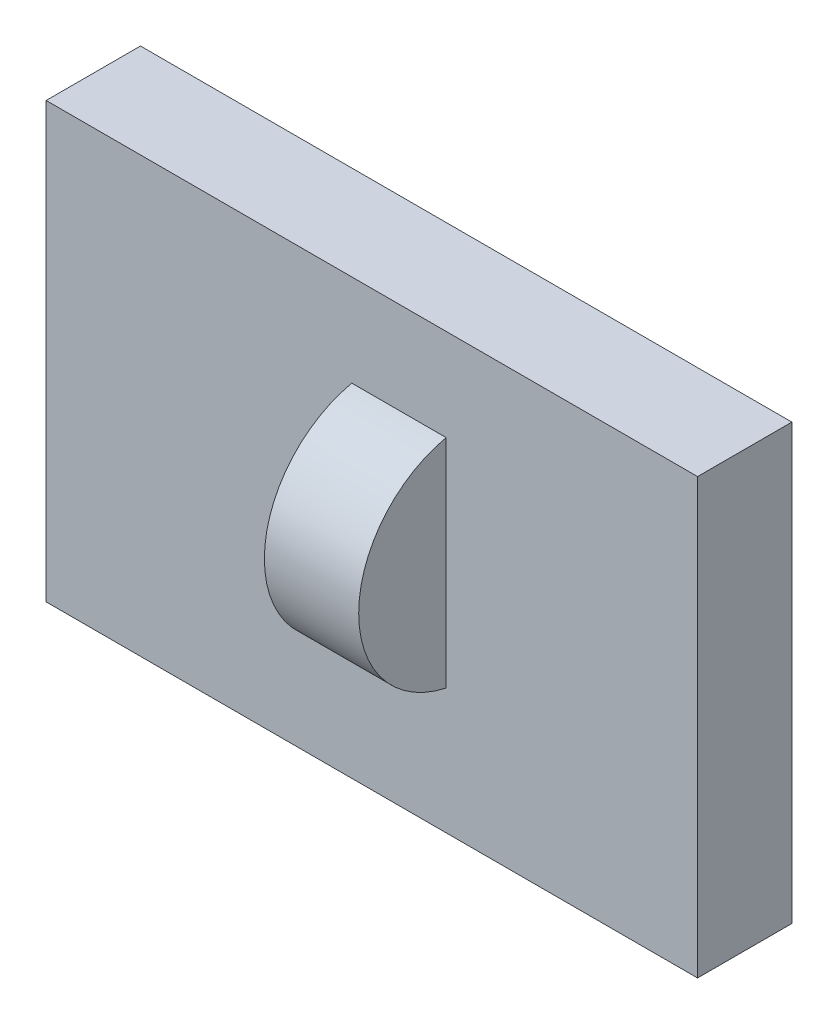
ISO-10303-21;
HEADER;
FILE_DESCRIPTION(('STEP AP214'),'2;1');
FILE_NAME('part.step','',(''),(''),'','','');
FILE_SCHEMA(('AUTOMOTIVE_DESIGN { 1 0 10303 214 1 1 1 1 }'));
ENDSEC;
DATA;
#1=APPLICATION_CONTEXT('core data for automotive mechanical design processes');
#2=APPLICATION_PROTOCOL_DEFINITION('international standard','automotive_design',2000,#1);
#3=PRODUCT_CONTEXT('',#1,'mechanical');
#4=PRODUCT('Part','Part','',(#3));
#5=PRODUCT_RELATED_PRODUCT_CATEGORY('part','',(#4));
#6=PRODUCT_DEFINITION_FORMATION('','',#4);
#7=PRODUCT_DEFINITION_CONTEXT('part definition',#1,'design');
#8=PRODUCT_DEFINITION('design','',#6,#7);
#9=PRODUCT_DEFINITION_SHAPE('','',#8);
#10=(LENGTH_UNIT() NAMED_UNIT(*) SI_UNIT(.MILLI.,.METRE.));
#11=(NAMED_UNIT(*) PLANE_ANGLE_UNIT() SI_UNIT($,.RADIAN.));
#12=(NAMED_UNIT(*) SI_UNIT($,.STERADIAN.) SOLID_ANGLE_UNIT());
#13=UNCERTAINTY_MEASURE_WITH_UNIT(LENGTH_MEASURE(1.E-05),#10,'distance_accuracy_value','');
#14=(GEOMETRIC_REPRESENTATION_CONTEXT(3) GLOBAL_UNCERTAINTY_ASSIGNED_CONTEXT((#13)) GLOBAL_UNIT_ASSIGNED_CONTEXT((#10,
#11,#12)) REPRESENTATION_CONTEXT('',''));
#15=CARTESIAN_POINT('',(0.,0.,0.));
#16=DIRECTION('',(0.,0.,1.));
#17=DIRECTION('',(1.,0.,0.));
#18=AXIS2_PLACEMENT_3D('',#15,#16,#17);
#19=CARTESIAN_POINT('',(10.,0.,-2.49777081928821));
#20=DIRECTION('',(1.,0.,0.));
#21=DIRECTION('',(0.,0.,-1.));
#22=AXIS2_PLACEMENT_3D('',#19,#20,#21);
#23=PLANE('',#22);
#24=CARTESIAN_POINT('',(10.,0.,-2.49777081928821));
#25=DIRECTION('',(1.,0.,0.));
#26=DIRECTION('',(0.,0.,-1.));
#27=AXIS2_PLACEMENT_3D('',#24,#25,#26);
#28=CIRCLE('',#27,11.76735074313);
#29=CARTESIAN_POINT('',(10.,-11.4992036439987,0.));
#30=VERTEX_POINT('',#29);
#31=CARTESIAN_POINT('',(10.,-9.06571016699289,-10.));
#32=VERTEX_POINT('',#31);
#33=EDGE_CURVE('E163',#30,#32,#28,.T.);
#34=ORIENTED_EDGE('',*,*,#33,.F.);
#35=DIRECTION('',(0.,1.,0.));
#36=VECTOR('',#35,1.);
#37=CARTESIAN_POINT('',(10.,0.,0.));
#38=LINE('',#37,#36);
#39=CARTESIAN_POINT('',(10.,11.4992036439987,0.));
#40=VERTEX_POINT('',#39);
#41=EDGE_CURVE('E154',#30,#40,#38,.T.);
#42=ORIENTED_EDGE('',*,*,#41,.T.);
#43=CARTESIAN_POINT('',(10.,9.06571016699289,-10.));
#44=VERTEX_POINT('',#43);
#45=EDGE_CURVE('E164',#44,#40,#28,.T.);
#46=ORIENTED_EDGE('',*,*,#45,.F.);
#47=DIRECTION('',(0.,1.,0.));
#48=VECTOR('',#47,1.);
#49=CARTESIAN_POINT('',(10.,0.,-10.));
#50=LINE('',#49,#48);
#51=EDGE_CURVE('E174',#32,#44,#50,.T.);
#52=ORIENTED_EDGE('',*,*,#51,.F.);
#53=EDGE_LOOP('',(#34,#42,#46,#52));
#54=FACE_BOUND('',#53,.T.);
#55=ADVANCED_FACE('F64',(#54),#23,.F.);
#56=CARTESIAN_POINT('',(0.,0.,-2.49777081928821));
#57=DIRECTION('',(1.,0.,0.));
#58=DIRECTION('',(0.,0.,-1.));
#59=AXIS2_PLACEMENT_3D('',#56,#57,#58);
#60=PLANE('',#59);
#61=DIRECTION('',(0.,1.,0.));
#62=VECTOR('',#61,1.);
#63=CARTESIAN_POINT('',(0.,0.,-10.));
#64=LINE('',#63,#62);
#65=CARTESIAN_POINT('',(0.,-9.06571016699289,-10.));
#66=VERTEX_POINT('',#65);
#67=CARTESIAN_POINT('',(0.,9.06571016699289,-10.));
#68=VERTEX_POINT('',#67);
#69=EDGE_CURVE('E168',#66,#68,#64,.T.);
#70=ORIENTED_EDGE('',*,*,#69,.T.);
#71=CARTESIAN_POINT('',(0.,0.,-2.49777081928821));
#72=DIRECTION('',(1.,0.,0.));
#73=DIRECTION('',(0.,0.,-1.));
#74=AXIS2_PLACEMENT_3D('',#71,#72,#73);
#75=CIRCLE('',#74,11.76735074313);
#76=CARTESIAN_POINT('',(0.,11.4992036439987,0.));
#77=VERTEX_POINT('',#76);
#78=EDGE_CURVE('E67',#68,#77,#75,.T.);
#79=ORIENTED_EDGE('',*,*,#78,.T.);
#80=DIRECTION('',(0.,1.,0.));
#81=VECTOR('',#80,1.);
#82=CARTESIAN_POINT('',(0.,0.,0.));
#83=LINE('',#82,#81);
#84=CARTESIAN_POINT('',(0.,-11.4992036439987,0.));
#85=VERTEX_POINT('',#84);
#86=EDGE_CURVE('E139',#85,#77,#83,.T.);
#87=ORIENTED_EDGE('',*,*,#86,.F.);
#88=EDGE_CURVE('E143',#85,#66,#75,.T.);
#89=ORIENTED_EDGE('',*,*,#88,.T.);
#90=EDGE_LOOP('',(#70,#79,#87,#89));
#91=FACE_BOUND('',#90,.T.);
#92=ADVANCED_FACE('F141',(#91),#60,.T.);
#93=CARTESIAN_POINT('',(10.,0.,-2.49777081928821));
#94=DIRECTION('',(-1.,0.,0.));
#95=DIRECTION('',(0.,0.,1.));
#96=AXIS2_PLACEMENT_3D('',#93,#94,#95);
#97=CYLINDRICAL_SURFACE('',#96,11.76735074313);
#98=DIRECTION('',(-1.,0.,0.));
#99=VECTOR('',#98,1.);
#100=CARTESIAN_POINT('',(10.,-9.06571016699289,-10.));
#101=LINE('',#100,#99);
#102=EDGE_CURVE('E162',#32,#66,#101,.T.);
#103=ORIENTED_EDGE('',*,*,#102,.T.);
#104=ORIENTED_EDGE('',*,*,#88,.F.);
#105=DIRECTION('',(-1.,0.,0.));
#106=VECTOR('',#105,1.);
#107=CARTESIAN_POINT('',(10.,-11.4992036439987,0.));
#108=LINE('',#107,#106);
#109=EDGE_CURVE('E149',#30,#85,#108,.T.);
#110=ORIENTED_EDGE('',*,*,#109,.F.);
#111=ORIENTED_EDGE('',*,*,#33,.T.);
#112=EDGE_LOOP('',(#103,#104,#110,#111));
#113=FACE_BOUND('',#112,.T.);
#114=ADVANCED_FACE('F160',(#113),#97,.F.);
#115=DIRECTION('',(-1.,0.,0.));
#116=VECTOR('',#115,1.);
#117=CARTESIAN_POINT('',(10.,9.06571016699289,-10.));
#118=LINE('',#117,#116);
#119=EDGE_CURVE('E171',#68,#44,#118,.F.);
#120=ORIENTED_EDGE('',*,*,#119,.T.);
#121=ORIENTED_EDGE('',*,*,#45,.T.);
#122=DIRECTION('',(-1.,0.,0.));
#123=VECTOR('',#122,1.);
#124=CARTESIAN_POINT('',(10.,11.4992036439987,0.));
#125=LINE('',#124,#123);
#126=EDGE_CURVE('E158',#77,#40,#125,.F.);
#127=ORIENTED_EDGE('',*,*,#126,.F.);
#128=ORIENTED_EDGE('',*,*,#78,.F.);
#129=EDGE_LOOP('',(#120,#121,#127,#128));
#130=FACE_BOUND('',#129,.T.);
#131=ADVANCED_FACE('F204',(#130),#97,.F.);
#132=CARTESIAN_POINT('',(-32.4073170430545,21.2506997003636,-10.));
#133=DIRECTION('',(0.,1.,0.));
#134=DIRECTION('',(0.,0.,1.));
#135=AXIS2_PLACEMENT_3D('',#132,#133,#134);
#136=PLANE('',#135);
#137=DIRECTION('',(-1.,0.,0.));
#138=VECTOR('',#137,1.);
#139=CARTESIAN_POINT('',(-32.4073170430545,21.2506997003636,0.));
#140=LINE('',#139,#138);
#141=CARTESIAN_POINT('',(36.6574569831272,21.2506997003636,0.));
#142=VERTEX_POINT('',#141);
#143=CARTESIAN_POINT('',(-32.4073170430545,21.2506997003636,0.));
#144=VERTEX_POINT('',#143);
#145=EDGE_CURVE('E178',#142,#144,#140,.T.);
#146=ORIENTED_EDGE('',*,*,#145,.F.);
#147=DIRECTION('',(0.,0.,1.));
#148=VECTOR('',#147,1.);
#149=CARTESIAN_POINT('',(36.6574569831272,21.2506997003636,-10.));
#150=LINE('',#149,#148);
#151=CARTESIAN_POINT('',(36.6574569831272,21.2506997003636,-10.));
#152=VERTEX_POINT('',#151);
#153=EDGE_CURVE('E193',#152,#142,#150,.T.);
#154=ORIENTED_EDGE('',*,*,#153,.F.);
#155=DIRECTION('',(-1.,0.,0.));
#156=VECTOR('',#155,1.);
#157=CARTESIAN_POINT('',(-32.4073170430545,21.2506997003636,-10.));
#158=LINE('',#157,#156);
#159=CARTESIAN_POINT('',(-32.4073170430545,21.2506997003636,-10.));
#160=VERTEX_POINT('',#159);
#161=EDGE_CURVE('E183',#152,#160,#158,.T.);
#162=ORIENTED_EDGE('',*,*,#161,.T.);
#163=DIRECTION('',(0.,0.,1.));
#164=VECTOR('',#163,1.);
#165=CARTESIAN_POINT('',(-32.4073170430545,21.2506997003636,-10.));
#166=LINE('',#165,#164);
#167=EDGE_CURVE('E111',#160,#144,#166,.T.);
#168=ORIENTED_EDGE('',*,*,#167,.T.);
#169=EDGE_LOOP('',(#146,#154,#162,#168));
#170=FACE_BOUND('',#169,.T.);
#171=ADVANCED_FACE('F206',(#170),#136,.T.);
#172=CARTESIAN_POINT('',(36.6574569831272,21.2506997003636,-10.));
#173=DIRECTION('',(1.,0.,0.));
#174=DIRECTION('',(0.,0.,-1.));
#175=AXIS2_PLACEMENT_3D('',#172,#173,#174);
#176=PLANE('',#175);
#177=DIRECTION('',(0.,1.,0.));
#178=VECTOR('',#177,1.);
#179=CARTESIAN_POINT('',(36.6574569831272,21.2506997003636,0.));
#180=LINE('',#179,#178);
#181=CARTESIAN_POINT('',(36.6574569831272,-24.7924829837576,0.));
#182=VERTEX_POINT('',#181);
#183=EDGE_CURVE('E187',#182,#142,#180,.T.);
#184=ORIENTED_EDGE('',*,*,#183,.F.);
#185=DIRECTION('',(0.,0.,1.));
#186=VECTOR('',#185,1.);
#187=CARTESIAN_POINT('',(36.6574569831272,-24.7924829837576,-10.));
#188=LINE('',#187,#186);
#189=CARTESIAN_POINT('',(36.6574569831272,-24.7924829837576,-10.));
#190=VERTEX_POINT('',#189);
#191=EDGE_CURVE('E100',#190,#182,#188,.T.);
#192=ORIENTED_EDGE('',*,*,#191,.F.);
#193=DIRECTION('',(0.,1.,0.));
#194=VECTOR('',#193,1.);
#195=CARTESIAN_POINT('',(36.6574569831272,21.2506997003636,-10.));
#196=LINE('',#195,#194);
#197=EDGE_CURVE('E181',#190,#152,#196,.T.);
#198=ORIENTED_EDGE('',*,*,#197,.T.);
#199=ORIENTED_EDGE('',*,*,#153,.T.);
#200=EDGE_LOOP('',(#184,#192,#198,#199));
#201=FACE_BOUND('',#200,.T.);
#202=ADVANCED_FACE('F211',(#201),#176,.T.);
#203=CARTESIAN_POINT('',(-32.4073170430545,-24.7924829837576,-10.));
#204=DIRECTION('',(0.,-1.,0.));
#205=DIRECTION('',(0.,0.,-1.));
#206=AXIS2_PLACEMENT_3D('',#203,#204,#205);
#207=PLANE('',#206);
#208=DIRECTION('',(1.,0.,0.));
#209=VECTOR('',#208,1.);
#210=CARTESIAN_POINT('',(-32.4073170430545,-24.7924829837576,0.));
#211=LINE('',#210,#209);
#212=CARTESIAN_POINT('',(-32.4073170430545,-24.7924829837576,0.));
#213=VERTEX_POINT('',#212);
#214=EDGE_CURVE('E73',#213,#182,#211,.T.);
#215=ORIENTED_EDGE('',*,*,#214,.F.);
#216=DIRECTION('',(0.,0.,1.));
#217=VECTOR('',#216,1.);
#218=CARTESIAN_POINT('',(-32.4073170430545,-24.7924829837576,-10.));
#219=LINE('',#218,#217);
#220=CARTESIAN_POINT('',(-32.4073170430545,-24.7924829837576,-10.));
#221=VERTEX_POINT('',#220);
#222=EDGE_CURVE('E82',#221,#213,#219,.T.);
#223=ORIENTED_EDGE('',*,*,#222,.F.);
#224=DIRECTION('',(1.,0.,0.));
#225=VECTOR('',#224,1.);
#226=CARTESIAN_POINT('',(-32.4073170430545,-24.7924829837576,-10.));
#227=LINE('',#226,#225);
#228=EDGE_CURVE('E179',#221,#190,#227,.T.);
#229=ORIENTED_EDGE('',*,*,#228,.T.);
#230=ORIENTED_EDGE('',*,*,#191,.T.);
#231=EDGE_LOOP('',(#215,#223,#229,#230));
#232=FACE_BOUND('',#231,.T.);
#233=ADVANCED_FACE('F228',(#232),#207,.T.);
#234=CARTESIAN_POINT('',(-32.4073170430545,21.2506997003636,-10.));
#235=DIRECTION('',(-1.,0.,0.));
#236=DIRECTION('',(0.,0.,1.));
#237=AXIS2_PLACEMENT_3D('',#234,#235,#236);
#238=PLANE('',#237);
#239=DIRECTION('',(0.,-1.,0.));
#240=VECTOR('',#239,1.);
#241=CARTESIAN_POINT('',(-32.4073170430545,21.2506997003636,0.));
#242=LINE('',#241,#240);
#243=EDGE_CURVE('E12',#144,#213,#242,.T.);
#244=ORIENTED_EDGE('',*,*,#243,.F.);
#245=ORIENTED_EDGE('',*,*,#167,.F.);
#246=DIRECTION('',(0.,-1.,0.));
#247=VECTOR('',#246,1.);
#248=CARTESIAN_POINT('',(-32.4073170430545,21.2506997003636,-10.));
#249=LINE('',#248,#247);
#250=EDGE_CURVE('E176',#160,#221,#249,.T.);
#251=ORIENTED_EDGE('',*,*,#250,.T.);
#252=ORIENTED_EDGE('',*,*,#222,.T.);
#253=EDGE_LOOP('',(#244,#245,#251,#252));
#254=FACE_BOUND('',#253,.T.);
#255=ADVANCED_FACE('F224',(#254),#238,.T.);
#256=CARTESIAN_POINT('',(0.,0.,0.));
#257=DIRECTION('',(0.,0.,1.));
#258=DIRECTION('',(1.,0.,0.));
#259=AXIS2_PLACEMENT_3D('',#256,#257,#258);
#260=PLANE('',#259);
#261=ORIENTED_EDGE('',*,*,#41,.F.);
#262=ORIENTED_EDGE('',*,*,#109,.T.);
#263=ORIENTED_EDGE('',*,*,#86,.T.);
#264=ORIENTED_EDGE('',*,*,#126,.T.);
#265=EDGE_LOOP('',(#261,#262,#263,#264));
#266=FACE_BOUND('',#265,.T.);
#267=ORIENTED_EDGE('',*,*,#243,.T.);
#268=ORIENTED_EDGE('',*,*,#214,.T.);
#269=ORIENTED_EDGE('',*,*,#183,.T.);
#270=ORIENTED_EDGE('',*,*,#145,.T.);
#271=EDGE_LOOP('',(#267,#268,#269,#270));
#272=FACE_BOUND('',#271,.T.);
#273=ADVANCED_FACE('F152',(#266,#272),#260,.T.);
#274=CARTESIAN_POINT('',(0.,0.,-10.));
#275=DIRECTION('',(0.,0.,1.));
#276=DIRECTION('',(1.,0.,0.));
#277=AXIS2_PLACEMENT_3D('',#274,#275,#276);
#278=PLANE('',#277);
#279=ORIENTED_EDGE('',*,*,#102,.F.);
#280=ORIENTED_EDGE('',*,*,#51,.T.);
#281=ORIENTED_EDGE('',*,*,#119,.F.);
#282=ORIENTED_EDGE('',*,*,#69,.F.);
#283=EDGE_LOOP('',(#279,#280,#281,#282));
#284=FACE_BOUND('',#283,.T.);
#285=ORIENTED_EDGE('',*,*,#250,.F.);
#286=ORIENTED_EDGE('',*,*,#161,.F.);
#287=ORIENTED_EDGE('',*,*,#197,.F.);
#288=ORIENTED_EDGE('',*,*,#228,.F.);
#289=EDGE_LOOP('',(#285,#286,#287,#288));
#290=FACE_BOUND('',#289,.T.);
#291=ADVANCED_FACE('F200',(#284,#290),#278,.F.);
#292=CLOSED_SHELL('',(#55,#92,#114,#131,#171,#202,#233,#255,#273,#291));
#293=MANIFOLD_SOLID_BREP('B2',#292);
#294=CARTESIAN_POINT('',(0.,0.,0.));
#295=DIRECTION('',(0.,0.,1.));
#296=DIRECTION('',(1.,0.,0.));
#297=AXIS2_PLACEMENT_3D('',#294,#295,#296);
#298=PLANE('',#297);
#299=DIRECTION('',(-1.,0.,0.));
#300=VECTOR('',#299,1.);
#301=CARTESIAN_POINT('',(10.,-11.4992036439987,0.));
#302=LINE('',#301,#300);
#303=CARTESIAN_POINT('',(10.,-11.4992036439987,0.));
#304=VERTEX_POINT('',#303);
#305=CARTESIAN_POINT('',(0.,-11.4992036439987,0.));
#306=VERTEX_POINT('',#305);
#307=EDGE_CURVE('E299',#304,#306,#302,.T.);
#308=ORIENTED_EDGE('',*,*,#307,.T.);
#309=DIRECTION('',(0.,1.,0.));
#310=VECTOR('',#309,1.);
#311=CARTESIAN_POINT('',(0.,0.,0.));
#312=LINE('',#311,#310);
#313=CARTESIAN_POINT('',(0.,11.4992036439987,0.));
#314=VERTEX_POINT('',#313);
#315=EDGE_CURVE('E62',#306,#314,#312,.T.);
#316=ORIENTED_EDGE('',*,*,#315,.T.);
#317=DIRECTION('',(-1.,0.,0.));
#318=VECTOR('',#317,1.);
#319=CARTESIAN_POINT('',(10.,11.4992036439987,0.));
#320=LINE('',#319,#318);
#321=CARTESIAN_POINT('',(10.,11.4992036439987,0.));
#322=VERTEX_POINT('',#321);
#323=EDGE_CURVE('E323',#314,#322,#320,.F.);
#324=ORIENTED_EDGE('',*,*,#323,.T.);
#325=DIRECTION('',(0.,1.,0.));
#326=VECTOR('',#325,1.);
#327=CARTESIAN_POINT('',(10.,0.,0.));
#328=LINE('',#327,#326);
#329=EDGE_CURVE('E306',#304,#322,#328,.T.);
#330=ORIENTED_EDGE('',*,*,#329,.F.);
#331=EDGE_LOOP('',(#308,#316,#324,#330));
#332=FACE_BOUND('',#331,.T.);
#333=ADVANCED_FACE('F290',(#332),#298,.F.);
#334=CARTESIAN_POINT('',(10.,0.,-2.49777081928821));
#335=DIRECTION('',(-1.,0.,0.));
#336=DIRECTION('',(0.,0.,1.));
#337=AXIS2_PLACEMENT_3D('',#334,#335,#336);
#338=CYLINDRICAL_SURFACE('',#337,11.76735074313);
#339=ORIENTED_EDGE('',*,*,#323,.F.);
#340=CARTESIAN_POINT('',(0.,0.,-2.49777081928821));
#341=DIRECTION('',(1.,0.,0.));
#342=DIRECTION('',(0.,0.,-1.));
#343=AXIS2_PLACEMENT_3D('',#340,#341,#342);
#344=CIRCLE('',#343,11.76735074313);
#345=EDGE_CURVE('E294',#314,#306,#344,.T.);
#346=ORIENTED_EDGE('',*,*,#345,.T.);
#347=ORIENTED_EDGE('',*,*,#307,.F.);
#348=CARTESIAN_POINT('',(10.,0.,-2.49777081928821));
#349=DIRECTION('',(1.,0.,0.));
#350=DIRECTION('',(0.,0.,-1.));
#351=AXIS2_PLACEMENT_3D('',#348,#349,#350);
#352=CIRCLE('',#351,11.76735074313);
#353=EDGE_CURVE('E325',#322,#304,#352,.T.);
#354=ORIENTED_EDGE('',*,*,#353,.F.);
#355=EDGE_LOOP('',(#339,#346,#347,#354));
#356=FACE_BOUND('',#355,.T.);
#357=ADVANCED_FACE('F292',(#356),#338,.T.);
#358=CARTESIAN_POINT('',(0.,0.,-2.49777081928821));
#359=DIRECTION('',(1.,0.,0.));
#360=DIRECTION('',(0.,0.,-1.));
#361=AXIS2_PLACEMENT_3D('',#358,#359,#360);
#362=PLANE('',#361);
#363=ORIENTED_EDGE('',*,*,#315,.F.);
#364=ORIENTED_EDGE('',*,*,#345,.F.);
#365=EDGE_LOOP('',(#363,#364));
#366=FACE_BOUND('',#365,.T.);
#367=ADVANCED_FACE('F319',(#366),#362,.F.);
#368=CARTESIAN_POINT('',(10.,0.,-2.49777081928821));
#369=DIRECTION('',(1.,0.,0.));
#370=DIRECTION('',(0.,0.,-1.));
#371=AXIS2_PLACEMENT_3D('',#368,#369,#370);
#372=PLANE('',#371);
#373=ORIENTED_EDGE('',*,*,#353,.T.);
#374=ORIENTED_EDGE('',*,*,#329,.T.);
#375=EDGE_LOOP('',(#373,#374));
#376=FACE_BOUND('',#375,.T.);
#377=ADVANCED_FACE('F328',(#376),#372,.T.);
#378=CLOSED_SHELL('',(#333,#357,#367,#377));
#379=MANIFOLD_SOLID_BREP('B6',#378);
#380=ADVANCED_BREP_SHAPE_REPRESENTATION('',(#18,#293,#379),#14);
#381=SHAPE_DEFINITION_REPRESENTATION(#9,#380);
ENDSEC;
END-ISO-10303-21;
